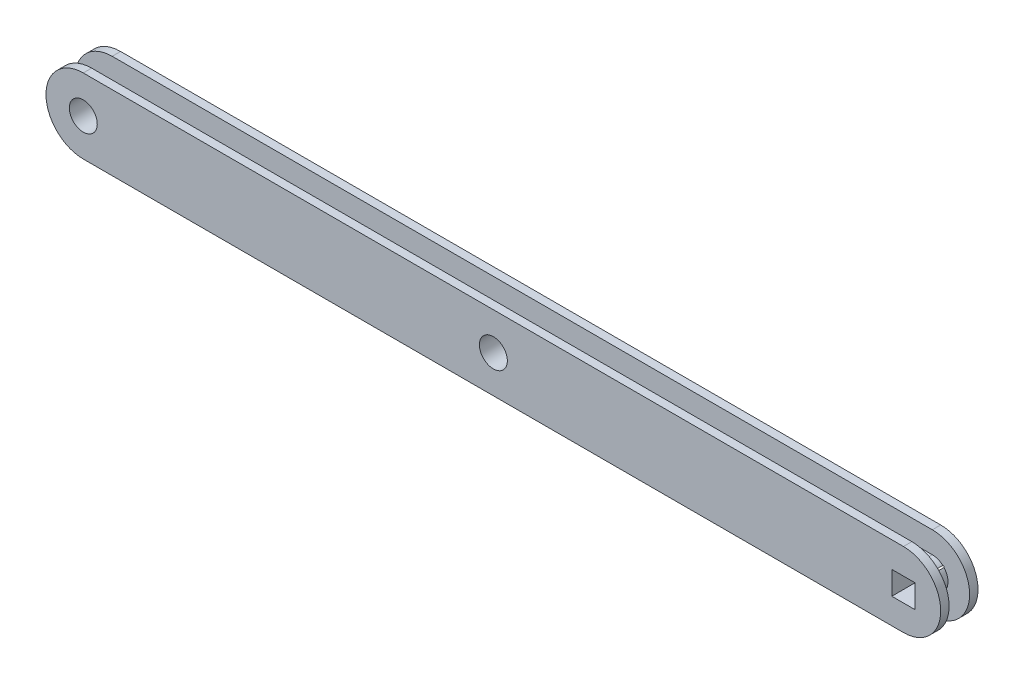
ISO-10303-21;
HEADER;
FILE_DESCRIPTION(('STEP AP214'),'2;1');
FILE_NAME('part.step','',(''),(''),'','','');
FILE_SCHEMA(('AUTOMOTIVE_DESIGN { 1 0 10303 214 1 1 1 1 }'));
ENDSEC;
DATA;
#1=APPLICATION_CONTEXT('core data for automotive mechanical design processes');
#2=APPLICATION_PROTOCOL_DEFINITION('international standard','automotive_design',2000,#1);
#3=PRODUCT_CONTEXT('',#1,'mechanical');
#4=PRODUCT('Part','Part','',(#3));
#5=PRODUCT_RELATED_PRODUCT_CATEGORY('part','',(#4));
#6=PRODUCT_DEFINITION_FORMATION('','',#4);
#7=PRODUCT_DEFINITION_CONTEXT('part definition',#1,'design');
#8=PRODUCT_DEFINITION('design','',#6,#7);
#9=PRODUCT_DEFINITION_SHAPE('','',#8);
#10=(LENGTH_UNIT() NAMED_UNIT(*) SI_UNIT(.MILLI.,.METRE.));
#11=(NAMED_UNIT(*) PLANE_ANGLE_UNIT() SI_UNIT($,.RADIAN.));
#12=(NAMED_UNIT(*) SI_UNIT($,.STERADIAN.) SOLID_ANGLE_UNIT());
#13=UNCERTAINTY_MEASURE_WITH_UNIT(LENGTH_MEASURE(1.E-05),#10,'distance_accuracy_value','');
#14=(GEOMETRIC_REPRESENTATION_CONTEXT(3) GLOBAL_UNCERTAINTY_ASSIGNED_CONTEXT((#13)) GLOBAL_UNIT_ASSIGNED_CONTEXT((#10,
#11,#12)) REPRESENTATION_CONTEXT('',''));
#15=CARTESIAN_POINT('',(0.,0.,0.));
#16=DIRECTION('',(0.,0.,1.));
#17=DIRECTION('',(1.,0.,0.));
#18=AXIS2_PLACEMENT_3D('',#15,#16,#17);
#19=CARTESIAN_POINT('',(0.,0.,-6.35));
#20=DIRECTION('',(0.,-1.,0.));
#21=DIRECTION('',(1.,0.,0.));
#22=AXIS2_PLACEMENT_3D('',#19,#20,#21);
#23=PLANE('',#22);
#24=DIRECTION('',(0.,0.,1.));
#25=VECTOR('',#24,1.);
#26=CARTESIAN_POINT('',(-146.05,0.,-6.35));
#27=LINE('',#26,#25);
#28=CARTESIAN_POINT('',(-146.05,0.,-1.427499939));
#29=VERTEX_POINT('',#28);
#30=CARTESIAN_POINT('',(-146.05,0.,0.));
#31=VERTEX_POINT('',#30);
#32=EDGE_CURVE('E475',#29,#31,#27,.T.);
#33=ORIENTED_EDGE('',*,*,#32,.F.);
#34=DIRECTION('',(1.,0.,0.));
#35=VECTOR('',#34,1.);
#36=CARTESIAN_POINT('',(-152.4,0.,-1.427499939));
#37=LINE('',#36,#35);
#38=CARTESIAN_POINT('',(-6.35000000000005,0.,-1.427499939));
#39=VERTEX_POINT('',#38);
#40=EDGE_CURVE('E458',#29,#39,#37,.T.);
#41=ORIENTED_EDGE('',*,*,#40,.T.);
#42=DIRECTION('',(0.,0.,1.));
#43=VECTOR('',#42,1.);
#44=CARTESIAN_POINT('',(-6.34999999999999,0.,-6.35));
#45=LINE('',#44,#43);
#46=CARTESIAN_POINT('',(-6.34999999999999,0.,0.));
#47=VERTEX_POINT('',#46);
#48=EDGE_CURVE('E506',#39,#47,#45,.T.);
#49=ORIENTED_EDGE('',*,*,#48,.T.);
#50=DIRECTION('',(1.,0.,0.));
#51=VECTOR('',#50,1.);
#52=CARTESIAN_POINT('',(0.,0.,0.));
#53=LINE('',#52,#51);
#54=EDGE_CURVE('E482',#31,#47,#53,.T.);
#55=ORIENTED_EDGE('',*,*,#54,.F.);
#56=EDGE_LOOP('',(#33,#41,#49,#55));
#57=FACE_BOUND('',#56,.T.);
#58=ADVANCED_FACE('F298',(#57),#23,.T.);
#59=CARTESIAN_POINT('',(-6.34999999999999,0.,-6.35));
#60=VERTEX_POINT('',#59);
#61=CARTESIAN_POINT('',(-6.35000000000005,0.,-4.922500061));
#62=VERTEX_POINT('',#61);
#63=EDGE_CURVE('E454',#60,#62,#45,.T.);
#64=ORIENTED_EDGE('',*,*,#63,.T.);
#65=DIRECTION('',(1.,0.,0.));
#66=VECTOR('',#65,1.);
#67=CARTESIAN_POINT('',(-152.4,0.,-4.922500061));
#68=LINE('',#67,#66);
#69=CARTESIAN_POINT('',(-146.05,0.,-4.922500061));
#70=VERTEX_POINT('',#69);
#71=EDGE_CURVE('E447',#70,#62,#68,.T.);
#72=ORIENTED_EDGE('',*,*,#71,.F.);
#73=CARTESIAN_POINT('',(-146.05,0.,-6.35));
#74=VERTEX_POINT('',#73);
#75=EDGE_CURVE('E451',#74,#70,#27,.T.);
#76=ORIENTED_EDGE('',*,*,#75,.F.);
#77=DIRECTION('',(1.,0.,0.));
#78=VECTOR('',#77,1.);
#79=CARTESIAN_POINT('',(0.,0.,-6.35));
#80=LINE('',#79,#78);
#81=EDGE_CURVE('E490',#74,#60,#80,.T.);
#82=ORIENTED_EDGE('',*,*,#81,.T.);
#83=EDGE_LOOP('',(#64,#72,#76,#82));
#84=FACE_BOUND('',#83,.T.);
#85=ADVANCED_FACE('F449',(#84),#23,.T.);
#86=CARTESIAN_POINT('',(-152.4,12.7,-6.35));
#87=DIRECTION('',(0.,1.,0.));
#88=DIRECTION('',(-1.,0.,0.));
#89=AXIS2_PLACEMENT_3D('',#86,#87,#88);
#90=PLANE('',#89);
#91=DIRECTION('',(1.,0.,0.));
#92=VECTOR('',#91,1.);
#93=CARTESIAN_POINT('',(-152.4,12.7,-1.427499939));
#94=LINE('',#93,#92);
#95=CARTESIAN_POINT('',(-146.05,12.7,-1.427499939));
#96=VERTEX_POINT('',#95);
#97=CARTESIAN_POINT('',(-6.35000000000008,12.7,-1.427499939));
#98=VERTEX_POINT('',#97);
#99=EDGE_CURVE('E640',#96,#98,#94,.T.);
#100=ORIENTED_EDGE('',*,*,#99,.F.);
#101=DIRECTION('',(0.,0.,1.));
#102=VECTOR('',#101,1.);
#103=CARTESIAN_POINT('',(-146.05,12.7,-6.35));
#104=LINE('',#103,#102);
#105=CARTESIAN_POINT('',(-146.05,12.7,0.));
#106=VERTEX_POINT('',#105);
#107=EDGE_CURVE('E495',#96,#106,#104,.T.);
#108=ORIENTED_EDGE('',*,*,#107,.T.);
#109=DIRECTION('',(-1.,0.,0.));
#110=VECTOR('',#109,1.);
#111=CARTESIAN_POINT('',(-152.4,12.7,0.));
#112=LINE('',#111,#110);
#113=CARTESIAN_POINT('',(-6.35,12.7,0.));
#114=VERTEX_POINT('',#113);
#115=EDGE_CURVE('E485',#114,#106,#112,.T.);
#116=ORIENTED_EDGE('',*,*,#115,.F.);
#117=DIRECTION('',(0.,0.,1.));
#118=VECTOR('',#117,1.);
#119=CARTESIAN_POINT('',(-6.35,12.7,-6.35));
#120=LINE('',#119,#118);
#121=EDGE_CURVE('E474',#98,#114,#120,.T.);
#122=ORIENTED_EDGE('',*,*,#121,.F.);
#123=EDGE_LOOP('',(#100,#108,#116,#122));
#124=FACE_BOUND('',#123,.T.);
#125=ADVANCED_FACE('F705',(#124),#90,.T.);
#126=CARTESIAN_POINT('',(-6.35,6.34999999999998,-6.35));
#127=DIRECTION('',(0.,0.,1.));
#128=DIRECTION('',(1.,0.,0.));
#129=AXIS2_PLACEMENT_3D('',#126,#127,#128);
#130=CYLINDRICAL_SURFACE('',#129,6.35);
#131=CARTESIAN_POINT('',(-6.35,6.34999999999998,-4.922500061));
#132=DIRECTION('',(0.,0.,1.));
#133=DIRECTION('',(1.,0.,0.));
#134=AXIS2_PLACEMENT_3D('',#131,#132,#133);
#135=CIRCLE('',#134,6.35);
#136=CARTESIAN_POINT('',(-6.35000000000008,12.7,-4.922500061));
#137=VERTEX_POINT('',#136);
#138=EDGE_CURVE('E609',#62,#137,#135,.T.);
#139=ORIENTED_EDGE('',*,*,#138,.F.);
#140=ORIENTED_EDGE('',*,*,#63,.F.);
#141=CARTESIAN_POINT('',(-6.35,6.34999999999998,-6.35));
#142=DIRECTION('',(0.,0.,1.));
#143=DIRECTION('',(1.,0.,0.));
#144=AXIS2_PLACEMENT_3D('',#141,#142,#143);
#145=CIRCLE('',#144,6.35);
#146=CARTESIAN_POINT('',(-6.35,12.7,-6.35));
#147=VERTEX_POINT('',#146);
#148=EDGE_CURVE('E496',#147,#60,#145,.F.);
#149=ORIENTED_EDGE('',*,*,#148,.F.);
#150=EDGE_CURVE('E477',#147,#137,#120,.T.);
#151=ORIENTED_EDGE('',*,*,#150,.T.);
#152=EDGE_LOOP('',(#139,#140,#149,#151));
#153=FACE_BOUND('',#152,.T.);
#154=ADVANCED_FACE('F675',(#153),#130,.T.);
#155=CARTESIAN_POINT('',(-6.35,6.34999999999998,-1.427499939));
#156=DIRECTION('',(0.,0.,-1.));
#157=DIRECTION('',(-1.,0.,0.));
#158=AXIS2_PLACEMENT_3D('',#155,#156,#157);
#159=CIRCLE('',#158,6.35);
#160=EDGE_CURVE('E599',#98,#39,#159,.T.);
#161=ORIENTED_EDGE('',*,*,#160,.F.);
#162=ORIENTED_EDGE('',*,*,#121,.T.);
#163=CARTESIAN_POINT('',(-6.35,6.34999999999998,0.));
#164=DIRECTION('',(0.,0.,1.));
#165=DIRECTION('',(1.,0.,0.));
#166=AXIS2_PLACEMENT_3D('',#163,#164,#165);
#167=CIRCLE('',#166,6.35);
#168=EDGE_CURVE('E500',#114,#47,#167,.F.);
#169=ORIENTED_EDGE('',*,*,#168,.T.);
#170=ORIENTED_EDGE('',*,*,#48,.F.);
#171=EDGE_LOOP('',(#161,#162,#169,#170));
#172=FACE_BOUND('',#171,.T.);
#173=ADVANCED_FACE('F712',(#172),#130,.T.);
#174=CARTESIAN_POINT('',(0.,8.33379802270045,-6.35));
#175=DIRECTION('',(0.,-1.,0.));
#176=DIRECTION('',(0.,0.,-1.));
#177=AXIS2_PLACEMENT_3D('',#174,#175,#176);
#178=PLANE('',#177);
#179=DIRECTION('',(0.,0.,1.));
#180=VECTOR('',#179,1.);
#181=CARTESIAN_POINT('',(-4.36620197729954,8.33379802270045,-6.35));
#182=LINE('',#181,#180);
#183=CARTESIAN_POINT('',(-4.36620197729954,8.33379802270045,-6.35));
#184=VERTEX_POINT('',#183);
#185=CARTESIAN_POINT('',(-4.36620197729954,8.33379802270045,-4.922500061));
#186=VERTEX_POINT('',#185);
#187=EDGE_CURVE('E539',#184,#186,#182,.T.);
#188=ORIENTED_EDGE('',*,*,#187,.T.);
#189=DIRECTION('',(-1.,0.,0.));
#190=VECTOR('',#189,1.);
#191=CARTESIAN_POINT('',(0.,8.33379802270045,-4.922500061));
#192=LINE('',#191,#190);
#193=CARTESIAN_POINT('',(-4.56746405221947,8.33379802270045,-4.922500061));
#194=VERTEX_POINT('',#193);
#195=EDGE_CURVE('E607',#186,#194,#192,.T.);
#196=ORIENTED_EDGE('',*,*,#195,.T.);
#197=DIRECTION('',(0.,0.,-1.));
#198=VECTOR('',#197,1.);
#199=CARTESIAN_POINT('',(-4.56746405221947,8.33379802270045,-6.35));
#200=LINE('',#199,#198);
#201=CARTESIAN_POINT('',(-4.56746405221947,8.33379802270045,-1.427499939));
#202=VERTEX_POINT('',#201);
#203=EDGE_CURVE('E577',#194,#202,#200,.F.);
#204=ORIENTED_EDGE('',*,*,#203,.T.);
#205=DIRECTION('',(1.,0.,0.));
#206=VECTOR('',#205,1.);
#207=CARTESIAN_POINT('',(0.,8.33379802270045,-1.427499939));
#208=LINE('',#207,#206);
#209=CARTESIAN_POINT('',(-4.36620197729954,8.33379802270045,-1.427499939));
#210=VERTEX_POINT('',#209);
#211=EDGE_CURVE('E595',#202,#210,#208,.T.);
#212=ORIENTED_EDGE('',*,*,#211,.T.);
#213=CARTESIAN_POINT('',(-4.36620197729954,8.33379802270045,0.));
#214=VERTEX_POINT('',#213);
#215=EDGE_CURVE('E525',#210,#214,#182,.T.);
#216=ORIENTED_EDGE('',*,*,#215,.T.);
#217=DIRECTION('',(1.,0.,0.));
#218=VECTOR('',#217,1.);
#219=CARTESIAN_POINT('',(0.,8.33379802270045,0.));
#220=LINE('',#219,#218);
#221=CARTESIAN_POINT('',(-8.33379802270047,8.33379802270045,0.));
#222=VERTEX_POINT('',#221);
#223=EDGE_CURVE('E529',#222,#214,#220,.T.);
#224=ORIENTED_EDGE('',*,*,#223,.F.);
#225=DIRECTION('',(0.,0.,1.));
#226=VECTOR('',#225,1.);
#227=CARTESIAN_POINT('',(-8.33379802270047,8.33379802270045,-6.35));
#228=LINE('',#227,#226);
#229=CARTESIAN_POINT('',(-8.33379802270047,8.33379802270045,-6.35));
#230=VERTEX_POINT('',#229);
#231=EDGE_CURVE('E518',#230,#222,#228,.T.);
#232=ORIENTED_EDGE('',*,*,#231,.F.);
#233=DIRECTION('',(1.,0.,0.));
#234=VECTOR('',#233,1.);
#235=CARTESIAN_POINT('',(0.,8.33379802270045,-6.35));
#236=LINE('',#235,#234);
#237=EDGE_CURVE('E523',#230,#184,#236,.T.);
#238=ORIENTED_EDGE('',*,*,#237,.T.);
#239=EDGE_LOOP('',(#188,#196,#204,#212,#216,#224,#232,#238));
#240=FACE_BOUND('',#239,.T.);
#241=ADVANCED_FACE('F592',(#240),#178,.T.);
#242=CARTESIAN_POINT('',(-4.36620197729954,0.,-6.35));
#243=DIRECTION('',(1.,0.,0.));
#244=DIRECTION('',(0.,0.,-1.));
#245=AXIS2_PLACEMENT_3D('',#242,#243,#244);
#246=PLANE('',#245);
#247=DIRECTION('',(0.,-1.,0.));
#248=VECTOR('',#247,1.);
#249=CARTESIAN_POINT('',(-4.36620197729954,0.,-4.922500061));
#250=LINE('',#249,#248);
#251=CARTESIAN_POINT('',(-4.36620197729954,4.56746405221946,-4.922500061));
#252=VERTEX_POINT('',#251);
#253=CARTESIAN_POINT('',(-4.36620197729954,4.36620197729952,-4.922500061));
#254=VERTEX_POINT('',#253);
#255=EDGE_CURVE('E601',#252,#254,#250,.T.);
#256=ORIENTED_EDGE('',*,*,#255,.F.);
#257=DIRECTION('',(0.,0.,-1.));
#258=VECTOR('',#257,1.);
#259=CARTESIAN_POINT('',(-4.36620197729954,4.56746405221946,-6.35));
#260=LINE('',#259,#258);
#261=CARTESIAN_POINT('',(-4.36620197729954,4.56746405221946,-1.427499939));
#262=VERTEX_POINT('',#261);
#263=EDGE_CURVE('E575',#262,#252,#260,.T.);
#264=ORIENTED_EDGE('',*,*,#263,.F.);
#265=DIRECTION('',(0.,1.,0.));
#266=VECTOR('',#265,1.);
#267=CARTESIAN_POINT('',(-4.36620197729954,0.,-1.427499939));
#268=LINE('',#267,#266);
#269=CARTESIAN_POINT('',(-4.36620197729954,4.36620197729952,-1.427499939));
#270=VERTEX_POINT('',#269);
#271=EDGE_CURVE('E564',#270,#262,#268,.T.);
#272=ORIENTED_EDGE('',*,*,#271,.F.);
#273=DIRECTION('',(0.,0.,1.));
#274=VECTOR('',#273,1.);
#275=CARTESIAN_POINT('',(-4.36620197729954,4.36620197729952,-6.35));
#276=LINE('',#275,#274);
#277=CARTESIAN_POINT('',(-4.36620197729954,4.36620197729952,0.));
#278=VERTEX_POINT('',#277);
#279=EDGE_CURVE('E538',#270,#278,#276,.T.);
#280=ORIENTED_EDGE('',*,*,#279,.T.);
#281=DIRECTION('',(0.,1.,0.));
#282=VECTOR('',#281,1.);
#283=CARTESIAN_POINT('',(-4.36620197729954,0.,0.));
#284=LINE('',#283,#282);
#285=EDGE_CURVE('E535',#278,#214,#284,.T.);
#286=ORIENTED_EDGE('',*,*,#285,.T.);
#287=ORIENTED_EDGE('',*,*,#215,.F.);
#288=CARTESIAN_POINT('',(-4.36620197729954,8.13253594778051,-1.427499939));
#289=VERTEX_POINT('',#288);
#290=EDGE_CURVE('E576',#289,#210,#268,.T.);
#291=ORIENTED_EDGE('',*,*,#290,.F.);
#292=DIRECTION('',(0.,0.,-1.));
#293=VECTOR('',#292,1.);
#294=CARTESIAN_POINT('',(-4.36620197729954,8.13253594778051,-6.35));
#295=LINE('',#294,#293);
#296=CARTESIAN_POINT('',(-4.36620197729954,8.13253594778051,-4.922500061));
#297=VERTEX_POINT('',#296);
#298=EDGE_CURVE('E645',#297,#289,#295,.F.);
#299=ORIENTED_EDGE('',*,*,#298,.F.);
#300=EDGE_CURVE('E606',#186,#297,#250,.T.);
#301=ORIENTED_EDGE('',*,*,#300,.F.);
#302=ORIENTED_EDGE('',*,*,#187,.F.);
#303=DIRECTION('',(0.,1.,0.));
#304=VECTOR('',#303,1.);
#305=CARTESIAN_POINT('',(-4.36620197729954,0.,-6.35));
#306=LINE('',#305,#304);
#307=CARTESIAN_POINT('',(-4.36620197729954,4.36620197729952,-6.35));
#308=VERTEX_POINT('',#307);
#309=EDGE_CURVE('E499',#308,#184,#306,.T.);
#310=ORIENTED_EDGE('',*,*,#309,.F.);
#311=EDGE_CURVE('E534',#308,#254,#276,.T.);
#312=ORIENTED_EDGE('',*,*,#311,.T.);
#313=EDGE_LOOP('',(#256,#264,#272,#280,#286,#287,#291,#299,#301,#302,#310,#312));
#314=FACE_BOUND('',#313,.T.);
#315=ADVANCED_FACE('F574',(#314),#246,.F.);
#316=CARTESIAN_POINT('',(0.,4.36620197729952,-6.35));
#317=DIRECTION('',(0.,-1.,0.));
#318=DIRECTION('',(0.,0.,-1.));
#319=AXIS2_PLACEMENT_3D('',#316,#317,#318);
#320=PLANE('',#319);
#321=DIRECTION('',(-1.,0.,0.));
#322=VECTOR('',#321,1.);
#323=CARTESIAN_POINT('',(0.,4.36620197729952,-4.922500061));
#324=LINE('',#323,#322);
#325=CARTESIAN_POINT('',(-4.56746405221948,4.36620197729952,-4.922500061));
#326=VERTEX_POINT('',#325);
#327=EDGE_CURVE('E12',#254,#326,#324,.T.);
#328=ORIENTED_EDGE('',*,*,#327,.F.);
#329=ORIENTED_EDGE('',*,*,#311,.F.);
#330=DIRECTION('',(1.,0.,0.));
#331=VECTOR('',#330,1.);
#332=CARTESIAN_POINT('',(0.,4.36620197729952,-6.35));
#333=LINE('',#332,#331);
#334=CARTESIAN_POINT('',(-8.33379802270047,4.36620197729952,-6.35));
#335=VERTEX_POINT('',#334);
#336=EDGE_CURVE('E516',#335,#308,#333,.T.);
#337=ORIENTED_EDGE('',*,*,#336,.F.);
#338=DIRECTION('',(0.,0.,1.));
#339=VECTOR('',#338,1.);
#340=CARTESIAN_POINT('',(-8.33379802270047,4.36620197729952,-6.35));
#341=LINE('',#340,#339);
#342=CARTESIAN_POINT('',(-8.33379802270047,4.36620197729952,0.));
#343=VERTEX_POINT('',#342);
#344=EDGE_CURVE('E533',#335,#343,#341,.T.);
#345=ORIENTED_EDGE('',*,*,#344,.T.);
#346=DIRECTION('',(1.,0.,0.));
#347=VECTOR('',#346,1.);
#348=CARTESIAN_POINT('',(0.,4.36620197729952,0.));
#349=LINE('',#348,#347);
#350=EDGE_CURVE('E530',#343,#278,#349,.T.);
#351=ORIENTED_EDGE('',*,*,#350,.T.);
#352=ORIENTED_EDGE('',*,*,#279,.F.);
#353=DIRECTION('',(1.,0.,0.));
#354=VECTOR('',#353,1.);
#355=CARTESIAN_POINT('',(0.,4.36620197729952,-1.427499939));
#356=LINE('',#355,#354);
#357=CARTESIAN_POINT('',(-4.56746405221948,4.36620197729952,-1.427499939));
#358=VERTEX_POINT('',#357);
#359=EDGE_CURVE('E306',#358,#270,#356,.T.);
#360=ORIENTED_EDGE('',*,*,#359,.F.);
#361=DIRECTION('',(0.,0.,-1.));
#362=VECTOR('',#361,1.);
#363=CARTESIAN_POINT('',(-4.56746405221948,4.36620197729952,-6.35));
#364=LINE('',#363,#362);
#365=EDGE_CURVE('E468',#326,#358,#364,.F.);
#366=ORIENTED_EDGE('',*,*,#365,.F.);
#367=EDGE_LOOP('',(#328,#329,#337,#345,#351,#352,#360,#366));
#368=FACE_BOUND('',#367,.T.);
#369=ADVANCED_FACE('F580',(#368),#320,.F.);
#370=CARTESIAN_POINT('',(-146.05,6.34999999999998,-6.35));
#371=DIRECTION('',(0.,0.,1.));
#372=DIRECTION('',(1.,0.,0.));
#373=AXIS2_PLACEMENT_3D('',#370,#371,#372);
#374=CYLINDRICAL_SURFACE('',#373,6.35);
#375=ORIENTED_EDGE('',*,*,#75,.T.);
#376=CARTESIAN_POINT('',(-146.05,6.34999999999998,-4.922500061));
#377=DIRECTION('',(0.,0.,1.));
#378=DIRECTION('',(1.,0.,0.));
#379=AXIS2_PLACEMENT_3D('',#376,#377,#378);
#380=CIRCLE('',#379,6.35);
#381=CARTESIAN_POINT('',(-146.05,12.7,-4.922500061));
#382=VERTEX_POINT('',#381);
#383=EDGE_CURVE('E461',#70,#382,#380,.F.);
#384=ORIENTED_EDGE('',*,*,#383,.T.);
#385=CARTESIAN_POINT('',(-146.05,12.7,-6.35));
#386=VERTEX_POINT('',#385);
#387=EDGE_CURVE('E550',#386,#382,#104,.T.);
#388=ORIENTED_EDGE('',*,*,#387,.F.);
#389=CARTESIAN_POINT('',(-146.05,6.34999999999998,-6.35));
#390=DIRECTION('',(0.,0.,1.));
#391=DIRECTION('',(1.,0.,0.));
#392=AXIS2_PLACEMENT_3D('',#389,#390,#391);
#393=CIRCLE('',#392,6.35);
#394=EDGE_CURVE('E473',#386,#74,#393,.T.);
#395=ORIENTED_EDGE('',*,*,#394,.T.);
#396=EDGE_LOOP('',(#375,#384,#388,#395));
#397=FACE_BOUND('',#396,.T.);
#398=ADVANCED_FACE('F471',(#397),#374,.T.);
#399=ORIENTED_EDGE('',*,*,#107,.F.);
#400=CARTESIAN_POINT('',(-146.05,6.34999999999998,-1.427499939));
#401=DIRECTION('',(0.,0.,-1.));
#402=DIRECTION('',(-1.,0.,0.));
#403=AXIS2_PLACEMENT_3D('',#400,#401,#402);
#404=CIRCLE('',#403,6.35);
#405=EDGE_CURVE('E469',#96,#29,#404,.F.);
#406=ORIENTED_EDGE('',*,*,#405,.T.);
#407=ORIENTED_EDGE('',*,*,#32,.T.);
#408=CARTESIAN_POINT('',(-146.05,6.34999999999998,0.));
#409=DIRECTION('',(0.,0.,1.));
#410=DIRECTION('',(1.,0.,0.));
#411=AXIS2_PLACEMENT_3D('',#408,#409,#410);
#412=CIRCLE('',#411,6.35);
#413=EDGE_CURVE('E486',#106,#31,#412,.T.);
#414=ORIENTED_EDGE('',*,*,#413,.F.);
#415=EDGE_LOOP('',(#399,#406,#407,#414));
#416=FACE_BOUND('',#415,.T.);
#417=ADVANCED_FACE('F691',(#416),#374,.T.);
#418=CARTESIAN_POINT('',(0.,0.,0.));
#419=DIRECTION('',(0.,0.,-1.));
#420=DIRECTION('',(-1.,0.,0.));
#421=AXIS2_PLACEMENT_3D('',#418,#419,#420);
#422=PLANE('',#421);
#423=CARTESIAN_POINT('',(-76.2,6.34999999999998,0.));
#424=DIRECTION('',(0.,0.,1.));
#425=DIRECTION('',(1.,0.,0.));
#426=AXIS2_PLACEMENT_3D('',#423,#424,#425);
#427=CIRCLE('',#426,2.38125000000001);
#428=CARTESIAN_POINT('',(-73.81875,6.34999999999998,0.));
#429=VERTEX_POINT('',#428);
#430=EDGE_CURVE('E504',#429,#429,#427,.T.);
#431=ORIENTED_EDGE('',*,*,#430,.F.);
#432=EDGE_LOOP('',(#431));
#433=FACE_BOUND('',#432,.T.);
#434=CARTESIAN_POINT('',(-146.05,6.34999999999998,0.));
#435=DIRECTION('',(0.,0.,1.));
#436=DIRECTION('',(1.,0.,0.));
#437=AXIS2_PLACEMENT_3D('',#434,#435,#436);
#438=CIRCLE('',#437,2.38125000000001);
#439=CARTESIAN_POINT('',(-143.66875,6.34999999999998,0.));
#440=VERTEX_POINT('',#439);
#441=EDGE_CURVE('E492',#440,#440,#438,.T.);
#442=ORIENTED_EDGE('',*,*,#441,.F.);
#443=EDGE_LOOP('',(#442));
#444=FACE_BOUND('',#443,.T.);
#445=DIRECTION('',(0.,1.,0.));
#446=VECTOR('',#445,1.);
#447=CARTESIAN_POINT('',(-8.33379802270047,0.,0.));
#448=LINE('',#447,#446);
#449=EDGE_CURVE('E526',#343,#222,#448,.T.);
#450=ORIENTED_EDGE('',*,*,#449,.T.);
#451=ORIENTED_EDGE('',*,*,#223,.T.);
#452=ORIENTED_EDGE('',*,*,#285,.F.);
#453=ORIENTED_EDGE('',*,*,#350,.F.);
#454=EDGE_LOOP('',(#450,#451,#452,#453));
#455=FACE_BOUND('',#454,.T.);
#456=ORIENTED_EDGE('',*,*,#168,.F.);
#457=ORIENTED_EDGE('',*,*,#115,.T.);
#458=ORIENTED_EDGE('',*,*,#413,.T.);
#459=ORIENTED_EDGE('',*,*,#54,.T.);
#460=EDGE_LOOP('',(#456,#457,#458,#459));
#461=FACE_BOUND('',#460,.T.);
#462=ADVANCED_FACE('F585',(#433,#444,#455,#461),#422,.F.);
#463=CARTESIAN_POINT('',(0.,0.,-6.35));
#464=DIRECTION('',(0.,0.,-1.));
#465=DIRECTION('',(-1.,0.,0.));
#466=AXIS2_PLACEMENT_3D('',#463,#464,#465);
#467=PLANE('',#466);
#468=DIRECTION('',(-1.,0.,0.));
#469=VECTOR('',#468,1.);
#470=CARTESIAN_POINT('',(-152.4,12.7,-6.35));
#471=LINE('',#470,#469);
#472=EDGE_CURVE('E493',#147,#386,#471,.T.);
#473=ORIENTED_EDGE('',*,*,#472,.F.);
#474=ORIENTED_EDGE('',*,*,#148,.T.);
#475=ORIENTED_EDGE('',*,*,#81,.F.);
#476=ORIENTED_EDGE('',*,*,#394,.F.);
#477=EDGE_LOOP('',(#473,#474,#475,#476));
#478=FACE_BOUND('',#477,.T.);
#479=CARTESIAN_POINT('',(-76.2,6.34999999999998,-6.35));
#480=DIRECTION('',(0.,0.,1.));
#481=DIRECTION('',(1.,0.,0.));
#482=AXIS2_PLACEMENT_3D('',#479,#480,#481);
#483=CIRCLE('',#482,2.38125000000001);
#484=CARTESIAN_POINT('',(-73.81875,6.34999999999998,-6.35));
#485=VERTEX_POINT('',#484);
#486=EDGE_CURVE('E489',#485,#485,#483,.T.);
#487=ORIENTED_EDGE('',*,*,#486,.T.);
#488=EDGE_LOOP('',(#487));
#489=FACE_BOUND('',#488,.T.);
#490=CARTESIAN_POINT('',(-146.05,6.34999999999998,-6.35));
#491=DIRECTION('',(0.,0.,1.));
#492=DIRECTION('',(1.,0.,0.));
#493=AXIS2_PLACEMENT_3D('',#490,#491,#492);
#494=CIRCLE('',#493,2.38125000000001);
#495=CARTESIAN_POINT('',(-143.66875,6.34999999999998,-6.35));
#496=VERTEX_POINT('',#495);
#497=EDGE_CURVE('E509',#496,#496,#494,.T.);
#498=ORIENTED_EDGE('',*,*,#497,.T.);
#499=EDGE_LOOP('',(#498));
#500=FACE_BOUND('',#499,.T.);
#501=ORIENTED_EDGE('',*,*,#237,.F.);
#502=DIRECTION('',(0.,1.,0.));
#503=VECTOR('',#502,1.);
#504=CARTESIAN_POINT('',(-8.33379802270047,0.,-6.35));
#505=LINE('',#504,#503);
#506=EDGE_CURVE('E503',#335,#230,#505,.T.);
#507=ORIENTED_EDGE('',*,*,#506,.F.);
#508=ORIENTED_EDGE('',*,*,#336,.T.);
#509=ORIENTED_EDGE('',*,*,#309,.T.);
#510=EDGE_LOOP('',(#501,#507,#508,#509));
#511=FACE_BOUND('',#510,.T.);
#512=ADVANCED_FACE('F300',(#478,#489,#500,#511),#467,.T.);
#513=DIRECTION('',(1.,0.,0.));
#514=VECTOR('',#513,1.);
#515=CARTESIAN_POINT('',(-152.4,12.7,-4.922500061));
#516=LINE('',#515,#514);
#517=EDGE_CURVE('E464',#382,#137,#516,.T.);
#518=ORIENTED_EDGE('',*,*,#517,.T.);
#519=ORIENTED_EDGE('',*,*,#150,.F.);
#520=ORIENTED_EDGE('',*,*,#472,.T.);
#521=ORIENTED_EDGE('',*,*,#387,.T.);
#522=EDGE_LOOP('',(#518,#519,#520,#521));
#523=FACE_BOUND('',#522,.T.);
#524=ADVANCED_FACE('F672',(#523),#90,.T.);
#525=CARTESIAN_POINT('',(-146.05,6.34999999999998,-6.35));
#526=DIRECTION('',(0.,0.,1.));
#527=DIRECTION('',(1.,0.,0.));
#528=AXIS2_PLACEMENT_3D('',#525,#526,#527);
#529=CYLINDRICAL_SURFACE('',#528,2.38125000000001);
#530=ORIENTED_EDGE('',*,*,#497,.F.);
#531=EDGE_LOOP('',(#530));
#532=FACE_BOUND('',#531,.T.);
#533=ORIENTED_EDGE('',*,*,#441,.T.);
#534=EDGE_LOOP('',(#533));
#535=FACE_BOUND('',#534,.T.);
#536=ADVANCED_FACE('F683',(#532,#535),#529,.F.);
#537=CARTESIAN_POINT('',(-76.2,6.34999999999998,-6.35));
#538=DIRECTION('',(0.,0.,1.));
#539=DIRECTION('',(1.,0.,0.));
#540=AXIS2_PLACEMENT_3D('',#537,#538,#539);
#541=CYLINDRICAL_SURFACE('',#540,2.38125000000001);
#542=ORIENTED_EDGE('',*,*,#486,.F.);
#543=EDGE_LOOP('',(#542));
#544=FACE_BOUND('',#543,.T.);
#545=ORIENTED_EDGE('',*,*,#430,.T.);
#546=EDGE_LOOP('',(#545));
#547=FACE_BOUND('',#546,.T.);
#548=ADVANCED_FACE('F686',(#544,#547),#541,.F.);
#549=CARTESIAN_POINT('',(-8.33379802270047,0.,-6.35));
#550=DIRECTION('',(1.,0.,0.));
#551=DIRECTION('',(0.,0.,-1.));
#552=AXIS2_PLACEMENT_3D('',#549,#550,#551);
#553=PLANE('',#552);
#554=ORIENTED_EDGE('',*,*,#449,.F.);
#555=ORIENTED_EDGE('',*,*,#344,.F.);
#556=ORIENTED_EDGE('',*,*,#506,.T.);
#557=ORIENTED_EDGE('',*,*,#231,.T.);
#558=EDGE_LOOP('',(#554,#555,#556,#557));
#559=FACE_BOUND('',#558,.T.);
#560=ADVANCED_FACE('F658',(#559),#553,.T.);
#561=CARTESIAN_POINT('',(-146.050000000001,152.4,-4.922500061));
#562=DIRECTION('',(0.,0.,1.));
#563=DIRECTION('',(1.,0.,0.));
#564=AXIS2_PLACEMENT_3D('',#561,#562,#563);
#565=PLANE('',#564);
#566=DIRECTION('',(1.,0.,0.));
#567=VECTOR('',#566,1.);
#568=CARTESIAN_POINT('',(-152.4,3.68299999999997,-4.922500061));
#569=LINE('',#568,#567);
#570=CARTESIAN_POINT('',(-146.05,3.68299999999997,-4.922500061));
#571=VERTEX_POINT('',#570);
#572=CARTESIAN_POINT('',(-6.34999999999999,3.68299999999997,-4.922500061));
#573=VERTEX_POINT('',#572);
#574=EDGE_CURVE('E457',#571,#573,#569,.T.);
#575=ORIENTED_EDGE('',*,*,#574,.F.);
#576=CARTESIAN_POINT('',(-146.05,6.34999999999999,-4.922500061));
#577=DIRECTION('',(0.,0.,-1.));
#578=DIRECTION('',(-1.,0.,0.));
#579=AXIS2_PLACEMENT_3D('',#576,#577,#578);
#580=CIRCLE('',#579,2.66700000000001);
#581=CARTESIAN_POINT('',(-146.05,9.017,-4.922500061));
#582=VERTEX_POINT('',#581);
#583=EDGE_CURVE('E616',#571,#582,#580,.T.);
#584=ORIENTED_EDGE('',*,*,#583,.T.);
#585=DIRECTION('',(1.,0.,0.));
#586=VECTOR('',#585,1.);
#587=CARTESIAN_POINT('',(-152.4,9.017,-4.922500061));
#588=LINE('',#587,#586);
#589=CARTESIAN_POINT('',(-6.35000000000005,9.017,-4.922500061));
#590=VERTEX_POINT('',#589);
#591=EDGE_CURVE('E630',#582,#590,#588,.T.);
#592=ORIENTED_EDGE('',*,*,#591,.T.);
#593=CARTESIAN_POINT('',(-6.34999999999999,6.34999999999999,-4.922500061));
#594=DIRECTION('',(0.,0.,1.));
#595=DIRECTION('',(1.,0.,0.));
#596=AXIS2_PLACEMENT_3D('',#593,#594,#595);
#597=CIRCLE('',#596,2.66700000000001);
#598=EDGE_CURVE('E642',#194,#590,#597,.T.);
#599=ORIENTED_EDGE('',*,*,#598,.F.);
#600=ORIENTED_EDGE('',*,*,#195,.F.);
#601=ORIENTED_EDGE('',*,*,#300,.T.);
#602=EDGE_CURVE('E313',#252,#297,#597,.T.);
#603=ORIENTED_EDGE('',*,*,#602,.F.);
#604=ORIENTED_EDGE('',*,*,#255,.T.);
#605=ORIENTED_EDGE('',*,*,#327,.T.);
#606=EDGE_CURVE('E321',#573,#326,#597,.T.);
#607=ORIENTED_EDGE('',*,*,#606,.F.);
#608=EDGE_LOOP('',(#575,#584,#592,#599,#600,#601,#603,#604,#605,#607));
#609=FACE_BOUND('',#608,.T.);
#610=ORIENTED_EDGE('',*,*,#138,.T.);
#611=ORIENTED_EDGE('',*,*,#517,.F.);
#612=ORIENTED_EDGE('',*,*,#383,.F.);
#613=ORIENTED_EDGE('',*,*,#71,.T.);
#614=EDGE_LOOP('',(#610,#611,#612,#613));
#615=FACE_BOUND('',#614,.T.);
#616=ADVANCED_FACE('F462',(#609,#615),#565,.T.);
#617=CARTESIAN_POINT('',(-146.050000000001,152.4,-1.427499939));
#618=DIRECTION('',(0.,0.,-1.));
#619=DIRECTION('',(-1.,0.,0.));
#620=AXIS2_PLACEMENT_3D('',#617,#618,#619);
#621=PLANE('',#620);
#622=DIRECTION('',(1.,0.,0.));
#623=VECTOR('',#622,1.);
#624=CARTESIAN_POINT('',(-152.4,3.68299999999997,-1.427499939));
#625=LINE('',#624,#623);
#626=CARTESIAN_POINT('',(-146.05,3.68299999999997,-1.427499939));
#627=VERTEX_POINT('',#626);
#628=CARTESIAN_POINT('',(-6.35000000000005,3.68299999999999,-1.427499939));
#629=VERTEX_POINT('',#628);
#630=EDGE_CURVE('E625',#627,#629,#625,.T.);
#631=ORIENTED_EDGE('',*,*,#630,.T.);
#632=CARTESIAN_POINT('',(-6.34999999999999,6.34999999999999,-1.427499939));
#633=DIRECTION('',(0.,0.,1.));
#634=DIRECTION('',(1.,0.,0.));
#635=AXIS2_PLACEMENT_3D('',#632,#633,#634);
#636=CIRCLE('',#635,2.66700000000001);
#637=EDGE_CURVE('E567',#629,#358,#636,.T.);
#638=ORIENTED_EDGE('',*,*,#637,.T.);
#639=ORIENTED_EDGE('',*,*,#359,.T.);
#640=ORIENTED_EDGE('',*,*,#271,.T.);
#641=EDGE_CURVE('E646',#262,#289,#636,.T.);
#642=ORIENTED_EDGE('',*,*,#641,.T.);
#643=ORIENTED_EDGE('',*,*,#290,.T.);
#644=ORIENTED_EDGE('',*,*,#211,.F.);
#645=CARTESIAN_POINT('',(-6.34999999999999,9.017,-1.427499939));
#646=VERTEX_POINT('',#645);
#647=EDGE_CURVE('E627',#202,#646,#636,.T.);
#648=ORIENTED_EDGE('',*,*,#647,.T.);
#649=DIRECTION('',(1.,0.,0.));
#650=VECTOR('',#649,1.);
#651=CARTESIAN_POINT('',(-152.4,9.017,-1.427499939));
#652=LINE('',#651,#650);
#653=CARTESIAN_POINT('',(-146.05,9.017,-1.427499939));
#654=VERTEX_POINT('',#653);
#655=EDGE_CURVE('E626',#654,#646,#652,.T.);
#656=ORIENTED_EDGE('',*,*,#655,.F.);
#657=CARTESIAN_POINT('',(-146.05,6.34999999999999,-1.427499939));
#658=DIRECTION('',(0.,0.,-1.));
#659=DIRECTION('',(-1.,0.,0.));
#660=AXIS2_PLACEMENT_3D('',#657,#658,#659);
#661=CIRCLE('',#660,2.66700000000001);
#662=EDGE_CURVE('E479',#627,#654,#661,.T.);
#663=ORIENTED_EDGE('',*,*,#662,.F.);
#664=EDGE_LOOP('',(#631,#638,#639,#640,#642,#643,#644,#648,#656,#663));
#665=FACE_BOUND('',#664,.T.);
#666=ORIENTED_EDGE('',*,*,#40,.F.);
#667=ORIENTED_EDGE('',*,*,#405,.F.);
#668=ORIENTED_EDGE('',*,*,#99,.T.);
#669=ORIENTED_EDGE('',*,*,#160,.T.);
#670=EDGE_LOOP('',(#666,#667,#668,#669));
#671=FACE_BOUND('',#670,.T.);
#672=ADVANCED_FACE('F561',(#665,#671),#621,.T.);
#673=CARTESIAN_POINT('',(-146.05,6.34999999999999,-6.35));
#674=DIRECTION('',(0.,0.,-1.));
#675=DIRECTION('',(-1.,0.,0.));
#676=AXIS2_PLACEMENT_3D('',#673,#674,#675);
#677=CYLINDRICAL_SURFACE('',#676,2.66700000000001);
#678=ORIENTED_EDGE('',*,*,#583,.F.);
#679=DIRECTION('',(0.,0.,1.));
#680=VECTOR('',#679,1.);
#681=CARTESIAN_POINT('',(-146.05,3.68299999999997,0.));
#682=LINE('',#681,#680);
#683=EDGE_CURVE('E613',#571,#627,#682,.T.);
#684=ORIENTED_EDGE('',*,*,#683,.T.);
#685=ORIENTED_EDGE('',*,*,#662,.T.);
#686=DIRECTION('',(0.,0.,1.));
#687=VECTOR('',#686,1.);
#688=CARTESIAN_POINT('',(-146.05,9.017,0.));
#689=LINE('',#688,#687);
#690=EDGE_CURVE('E611',#582,#654,#689,.T.);
#691=ORIENTED_EDGE('',*,*,#690,.F.);
#692=EDGE_LOOP('',(#678,#684,#685,#691));
#693=FACE_BOUND('',#692,.T.);
#694=ADVANCED_FACE('F623',(#693),#677,.T.);
#695=CARTESIAN_POINT('',(-6.34999999999999,6.34999999999999,-6.35));
#696=DIRECTION('',(0.,0.,-1.));
#697=DIRECTION('',(1.,0.,0.));
#698=AXIS2_PLACEMENT_3D('',#695,#696,#697);
#699=CYLINDRICAL_SURFACE('',#698,2.66700000000001);
#700=ORIENTED_EDGE('',*,*,#263,.T.);
#701=ORIENTED_EDGE('',*,*,#602,.T.);
#702=ORIENTED_EDGE('',*,*,#298,.T.);
#703=ORIENTED_EDGE('',*,*,#641,.F.);
#704=EDGE_LOOP('',(#700,#701,#702,#703));
#705=FACE_BOUND('',#704,.T.);
#706=ADVANCED_FACE('F648',(#705),#699,.T.);
#707=ORIENTED_EDGE('',*,*,#365,.T.);
#708=ORIENTED_EDGE('',*,*,#637,.F.);
#709=DIRECTION('',(0.,0.,1.));
#710=VECTOR('',#709,1.);
#711=CARTESIAN_POINT('',(-6.34999999999999,3.68299999999997,0.));
#712=LINE('',#711,#710);
#713=EDGE_CURVE('E639',#573,#629,#712,.T.);
#714=ORIENTED_EDGE('',*,*,#713,.F.);
#715=ORIENTED_EDGE('',*,*,#606,.T.);
#716=EDGE_LOOP('',(#707,#708,#714,#715));
#717=FACE_BOUND('',#716,.T.);
#718=ADVANCED_FACE('F769',(#717),#699,.T.);
#719=ORIENTED_EDGE('',*,*,#598,.T.);
#720=DIRECTION('',(0.,0.,1.));
#721=VECTOR('',#720,1.);
#722=CARTESIAN_POINT('',(-6.34999999999999,9.017,0.));
#723=LINE('',#722,#721);
#724=EDGE_CURVE('E637',#590,#646,#723,.T.);
#725=ORIENTED_EDGE('',*,*,#724,.T.);
#726=ORIENTED_EDGE('',*,*,#647,.F.);
#727=ORIENTED_EDGE('',*,*,#203,.F.);
#728=EDGE_LOOP('',(#719,#725,#726,#727));
#729=FACE_BOUND('',#728,.T.);
#730=ADVANCED_FACE('F662',(#729),#699,.T.);
#731=CARTESIAN_POINT('',(-152.4,9.017,-1.427499939));
#732=DIRECTION('',(0.,-1.,0.));
#733=DIRECTION('',(0.,0.,-1.));
#734=AXIS2_PLACEMENT_3D('',#731,#732,#733);
#735=PLANE('',#734);
#736=ORIENTED_EDGE('',*,*,#690,.T.);
#737=ORIENTED_EDGE('',*,*,#655,.T.);
#738=ORIENTED_EDGE('',*,*,#724,.F.);
#739=ORIENTED_EDGE('',*,*,#591,.F.);
#740=EDGE_LOOP('',(#736,#737,#738,#739));
#741=FACE_BOUND('',#740,.T.);
#742=ADVANCED_FACE('F663',(#741),#735,.F.);
#743=CARTESIAN_POINT('',(-152.4,3.68299999999997,-1.427499939));
#744=DIRECTION('',(0.,-1.,0.));
#745=DIRECTION('',(1.,0.,0.));
#746=AXIS2_PLACEMENT_3D('',#743,#744,#745);
#747=PLANE('',#746);
#748=ORIENTED_EDGE('',*,*,#574,.T.);
#749=ORIENTED_EDGE('',*,*,#713,.T.);
#750=ORIENTED_EDGE('',*,*,#630,.F.);
#751=ORIENTED_EDGE('',*,*,#683,.F.);
#752=EDGE_LOOP('',(#748,#749,#750,#751));
#753=FACE_BOUND('',#752,.T.);
#754=ADVANCED_FACE('F781',(#753),#747,.T.);
#755=CLOSED_SHELL('',(#58,#85,#125,#154,#173,#241,#315,#369,#398,#417,#462,#512,#524,#536,#548,
#560,#616,#672,#694,#706,#718,#730,#742,#754));
#756=MANIFOLD_SOLID_BREP('B2',#755);
#757=ADVANCED_BREP_SHAPE_REPRESENTATION('',(#18,#756),#14);
#758=SHAPE_DEFINITION_REPRESENTATION(#9,#757);
ENDSEC;
END-ISO-10303-21;
